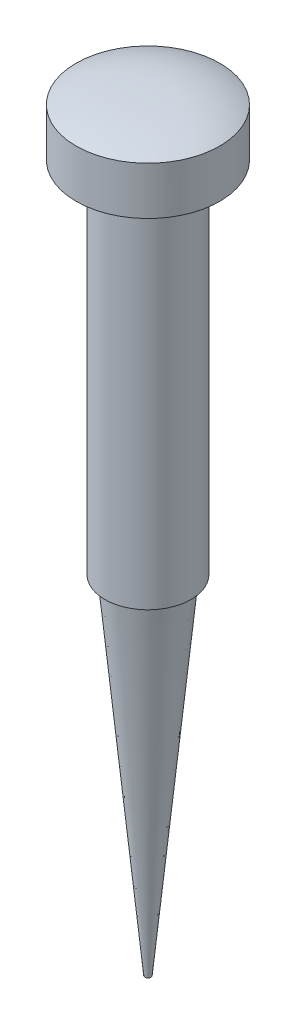
ISO-10303-21;
HEADER;
FILE_DESCRIPTION(('STEP AP214'),'2;1');
FILE_NAME('part.step','',(''),(''),'','','');
FILE_SCHEMA(('AUTOMOTIVE_DESIGN { 1 0 10303 214 1 1 1 1 }'));
ENDSEC;
DATA;
#1=APPLICATION_CONTEXT('core data for automotive mechanical design processes');
#2=APPLICATION_PROTOCOL_DEFINITION('international standard','automotive_design',2000,#1);
#3=PRODUCT_CONTEXT('',#1,'mechanical');
#4=PRODUCT('Part','Part','',(#3));
#5=PRODUCT_RELATED_PRODUCT_CATEGORY('part','',(#4));
#6=PRODUCT_DEFINITION_FORMATION('','',#4);
#7=PRODUCT_DEFINITION_CONTEXT('part definition',#1,'design');
#8=PRODUCT_DEFINITION('design','',#6,#7);
#9=PRODUCT_DEFINITION_SHAPE('','',#8);
#10=(LENGTH_UNIT() NAMED_UNIT(*) SI_UNIT(.MILLI.,.METRE.));
#11=(NAMED_UNIT(*) PLANE_ANGLE_UNIT() SI_UNIT($,.RADIAN.));
#12=(NAMED_UNIT(*) SI_UNIT($,.STERADIAN.) SOLID_ANGLE_UNIT());
#13=UNCERTAINTY_MEASURE_WITH_UNIT(LENGTH_MEASURE(1.E-05),#10,'distance_accuracy_value','');
#14=(GEOMETRIC_REPRESENTATION_CONTEXT(3) GLOBAL_UNCERTAINTY_ASSIGNED_CONTEXT((#13)) GLOBAL_UNIT_ASSIGNED_CONTEXT((#10,
#11,#12)) REPRESENTATION_CONTEXT('',''));
#15=CARTESIAN_POINT('',(0.,0.,0.));
#16=DIRECTION('',(0.,0.,1.));
#17=DIRECTION('',(1.,0.,0.));
#18=AXIS2_PLACEMENT_3D('',#15,#16,#17);
#19=CARTESIAN_POINT('',(0.,15.,0.));
#20=DIRECTION('',(0.,-1.,0.));
#21=DIRECTION('',(0.,0.,-1.));
#22=AXIS2_PLACEMENT_3D('',#19,#20,#21);
#23=CYLINDRICAL_SURFACE('',#22,1.8);
#24=CARTESIAN_POINT('',(0.,15.,0.));
#25=DIRECTION('',(0.,1.,0.));
#26=DIRECTION('',(0.,0.,1.));
#27=AXIS2_PLACEMENT_3D('',#24,#25,#26);
#28=CIRCLE('',#27,1.8);
#29=CARTESIAN_POINT('',(0.,15.,1.8));
#30=VERTEX_POINT('',#29);
#31=EDGE_CURVE('E11',#30,#30,#28,.T.);
#32=ORIENTED_EDGE('',*,*,#31,.F.);
#33=EDGE_LOOP('',(#32));
#34=FACE_BOUND('',#33,.T.);
#35=CARTESIAN_POINT('',(0.,0.,0.));
#36=DIRECTION('',(0.,1.,0.));
#37=DIRECTION('',(0.,0.,1.));
#38=AXIS2_PLACEMENT_3D('',#35,#36,#37);
#39=CIRCLE('',#38,1.8);
#40=CARTESIAN_POINT('',(0.,0.,1.8));
#41=VERTEX_POINT('',#40);
#42=EDGE_CURVE('E40',#41,#41,#39,.T.);
#43=ORIENTED_EDGE('',*,*,#42,.T.);
#44=EDGE_LOOP('',(#43));
#45=FACE_BOUND('',#44,.T.);
#46=ADVANCED_FACE('F37',(#34,#45),#23,.T.);
#47=CARTESIAN_POINT('',(0.,0.,0.));
#48=DIRECTION('',(0.,1.,0.));
#49=DIRECTION('',(0.,0.,1.));
#50=AXIS2_PLACEMENT_3D('',#47,#48,#49);
#51=PLANE('',#50);
#52=CARTESIAN_POINT('',(0.,0.,0.));
#53=DIRECTION('',(0.,1.,0.));
#54=DIRECTION('',(-1.,0.,0.));
#55=AXIS2_PLACEMENT_3D('',#52,#53,#54);
#56=CIRCLE('',#55,1.5007604023302);
#57=CARTESIAN_POINT('',(-1.5007604023302,0.,0.));
#58=VERTEX_POINT('',#57);
#59=EDGE_CURVE('E60',#58,#58,#56,.T.);
#60=ORIENTED_EDGE('',*,*,#59,.T.);
#61=EDGE_LOOP('',(#60));
#62=FACE_BOUND('',#61,.T.);
#63=ORIENTED_EDGE('',*,*,#42,.F.);
#64=EDGE_LOOP('',(#63));
#65=FACE_BOUND('',#64,.T.);
#66=ADVANCED_FACE('F79',(#62,#65),#51,.F.);
#67=CARTESIAN_POINT('',(0.,17.,0.));
#68=DIRECTION('',(0.,-1.,0.));
#69=DIRECTION('',(0.,0.,-1.));
#70=AXIS2_PLACEMENT_3D('',#67,#68,#69);
#71=CYLINDRICAL_SURFACE('',#70,3.);
#72=CARTESIAN_POINT('',(0.,17.,0.));
#73=DIRECTION('',(0.,1.,0.));
#74=DIRECTION('',(0.,0.,1.));
#75=AXIS2_PLACEMENT_3D('',#72,#73,#74);
#76=CIRCLE('',#75,3.);
#77=CARTESIAN_POINT('',(0.,17.,3.));
#78=VERTEX_POINT('',#77);
#79=EDGE_CURVE('E54',#78,#78,#76,.T.);
#80=ORIENTED_EDGE('',*,*,#79,.F.);
#81=EDGE_LOOP('',(#80));
#82=FACE_BOUND('',#81,.T.);
#83=CARTESIAN_POINT('',(0.,15.,0.));
#84=DIRECTION('',(0.,1.,0.));
#85=DIRECTION('',(0.,0.,1.));
#86=AXIS2_PLACEMENT_3D('',#83,#84,#85);
#87=CIRCLE('',#86,3.);
#88=CARTESIAN_POINT('',(0.,15.,3.));
#89=VERTEX_POINT('',#88);
#90=EDGE_CURVE('E56',#89,#89,#87,.T.);
#91=ORIENTED_EDGE('',*,*,#90,.T.);
#92=EDGE_LOOP('',(#91));
#93=FACE_BOUND('',#92,.T.);
#94=ADVANCED_FACE('F76',(#82,#93),#71,.T.);
#95=CARTESIAN_POINT('',(0.,15.,0.));
#96=DIRECTION('',(0.,1.,0.));
#97=DIRECTION('',(0.,0.,1.));
#98=AXIS2_PLACEMENT_3D('',#95,#96,#97);
#99=PLANE('',#98);
#100=ORIENTED_EDGE('',*,*,#31,.T.);
#101=EDGE_LOOP('',(#100));
#102=FACE_BOUND('',#101,.T.);
#103=ORIENTED_EDGE('',*,*,#90,.F.);
#104=EDGE_LOOP('',(#103));
#105=FACE_BOUND('',#104,.T.);
#106=ADVANCED_FACE('F50',(#102,#105),#99,.F.);
#107=CARTESIAN_POINT('',(-3.,17.,0.));
#108=CARTESIAN_POINT('',(-2.0274774752575,17.4627433731149,0.));
#109=CARTESIAN_POINT('',(-0.971060037154801,17.5,0.));
#110=CARTESIAN_POINT('',(0.,17.5,0.));
#111=B_SPLINE_CURVE_WITH_KNOTS('',3,(#107,#108,#109,#110),.UNSPECIFIED.,.F.,.F.,(4,4),(0.,1.),.UNSPECIFIED.);
#112=CARTESIAN_POINT('',(0.,17.,0.));
#113=DIRECTION('',(0.,-1.,0.));
#114=AXIS1_PLACEMENT('',#112,#113);
#115=SURFACE_OF_REVOLUTION('',#111,#114);
#116=CARTESIAN_POINT('',(0.,17.5,0.));
#117=VERTEX_POINT('',#116);
#118=VERTEX_LOOP('',#117);
#119=FACE_BOUND('',#118,.T.);
#120=ORIENTED_EDGE('',*,*,#79,.T.);
#121=EDGE_LOOP('',(#120));
#122=FACE_BOUND('',#121,.T.);
#123=ADVANCED_FACE('F46',(#119,#122),#115,.F.);
#124=CARTESIAN_POINT('',(0.,-14.5,0.));
#125=DIRECTION('',(0.,1.,0.));
#126=DIRECTION('',(-1.,0.,0.));
#127=AXIS2_PLACEMENT_3D('',#124,#125,#126);
#128=CONICAL_SURFACE('',#127,0.125,0.0945968454580859);
#129=CARTESIAN_POINT('',(0.,-14.5,0.));
#130=DIRECTION('',(0.,1.,0.));
#131=DIRECTION('',(-1.,0.,0.));
#132=AXIS2_PLACEMENT_3D('',#129,#130,#131);
#133=CIRCLE('',#132,0.125);
#134=CARTESIAN_POINT('',(-0.124999999999998,-14.5,0.));
#135=VERTEX_POINT('',#134);
#136=EDGE_CURVE('E92',#135,#135,#133,.T.);
#137=CARTESIAN_POINT('',(-1.5007604023302,0.,0.));
#138=CARTESIAN_POINT('',(-1.48642956480593,-0.151041666666668,0.));
#139=CARTESIAN_POINT('',(-1.47209872728166,-0.302083333333335,0.));
#140=CARTESIAN_POINT('',(-1.44343705223311,-0.604166666666669,0.));
#141=CARTESIAN_POINT('',(-1.42910621470884,-0.755208333333336,0.));
#142=CARTESIAN_POINT('',(-1.40044453966029,-1.05729166666667,0.));
#143=CARTESIAN_POINT('',(-1.38611370213602,-1.20833333333334,0.));
#144=CARTESIAN_POINT('',(-1.35745202708747,-1.51041666666667,0.));
#145=CARTESIAN_POINT('',(-1.3431211895632,-1.66145833333333,0.));
#146=CARTESIAN_POINT('',(-1.31445951451465,-1.96354166666667,0.));
#147=CARTESIAN_POINT('',(-1.30012867699038,-2.11458333333334,0.));
#148=CARTESIAN_POINT('',(-1.27146700194184,-2.41666666666667,0.));
#149=CARTESIAN_POINT('',(-1.25713616441756,-2.56770833333334,0.));
#150=CARTESIAN_POINT('',(-1.22847448936902,-2.86979166666667,0.));
#151=CARTESIAN_POINT('',(-1.21414365184474,-3.02083333333334,0.));
#152=CARTESIAN_POINT('',(-1.1854819767962,-3.32291666666667,0.));
#153=CARTESIAN_POINT('',(-1.17115113927192,-3.47395833333334,0.));
#154=CARTESIAN_POINT('',(-1.14248946422338,-3.77604166666667,0.));
#155=CARTESIAN_POINT('',(-1.12815862669911,-3.92708333333334,0.));
#156=CARTESIAN_POINT('',(-1.09949695165056,-4.22916666666667,0.));
#157=CARTESIAN_POINT('',(-1.08516611412629,-4.38020833333334,0.));
#158=CARTESIAN_POINT('',(-1.05650443907774,-4.68229166666667,0.));
#159=CARTESIAN_POINT('',(-1.04217360155347,-4.83333333333333,0.));
#160=CARTESIAN_POINT('',(-1.01351192650492,-5.13541666666667,0.));
#161=CARTESIAN_POINT('',(-0.999181088980649,-5.28645833333334,0.));
#162=CARTESIAN_POINT('',(-0.970519413932103,-5.58854166666667,0.));
#163=CARTESIAN_POINT('',(-0.956188576407831,-5.73958333333333,0.));
#164=CARTESIAN_POINT('',(-0.927526901359285,-6.04166666666667,0.));
#165=CARTESIAN_POINT('',(-0.913196063835012,-6.19270833333334,0.));
#166=CARTESIAN_POINT('',(-0.884534388786466,-6.49479166666667,0.));
#167=CARTESIAN_POINT('',(-0.870203551262193,-6.64583333333333,0.));
#168=CARTESIAN_POINT('',(-0.841541876213647,-6.94791666666667,0.));
#169=CARTESIAN_POINT('',(-0.827211038689374,-7.09895833333334,0.));
#170=CARTESIAN_POINT('',(-0.798549363640828,-7.40104166666667,0.));
#171=CARTESIAN_POINT('',(-0.784218526116555,-7.55208333333334,0.));
#172=CARTESIAN_POINT('',(-0.755556851068009,-7.85416666666667,0.));
#173=CARTESIAN_POINT('',(-0.741226013543736,-8.00520833333333,0.));
#174=CARTESIAN_POINT('',(-0.71256433849519,-8.30729166666667,0.));
#175=CARTESIAN_POINT('',(-0.698233500970917,-8.45833333333334,0.));
#176=CARTESIAN_POINT('',(-0.669571825922371,-8.76041666666667,0.));
#177=CARTESIAN_POINT('',(-0.655240988398098,-8.91145833333334,0.));
#178=CARTESIAN_POINT('',(-0.626579313349552,-9.21354166666667,0.));
#179=CARTESIAN_POINT('',(-0.612248475825279,-9.36458333333334,0.));
#180=CARTESIAN_POINT('',(-0.583586800776733,-9.66666666666667,0.));
#181=CARTESIAN_POINT('',(-0.56925596325246,-9.81770833333333,0.));
#182=CARTESIAN_POINT('',(-0.540594288203914,-10.1197916666667,0.));
#183=CARTESIAN_POINT('',(-0.526263450679641,-10.2708333333333,0.));
#184=CARTESIAN_POINT('',(-0.497601775631095,-10.5729166666667,0.));
#185=CARTESIAN_POINT('',(-0.483270938106822,-10.7239583333333,0.));
#186=CARTESIAN_POINT('',(-0.454609263058276,-11.0260416666667,0.));
#187=CARTESIAN_POINT('',(-0.440278425534003,-11.1770833333333,0.));
#188=CARTESIAN_POINT('',(-0.411616750485457,-11.4791666666667,0.));
#189=CARTESIAN_POINT('',(-0.397285912961184,-11.6302083333333,0.));
#190=CARTESIAN_POINT('',(-0.368624237912639,-11.9322916666667,0.));
#191=CARTESIAN_POINT('',(-0.354293400388366,-12.0833333333333,0.));
#192=CARTESIAN_POINT('',(-0.32563172533982,-12.3854166666667,0.));
#193=CARTESIAN_POINT('',(-0.311300887815547,-12.5364583333333,0.));
#194=CARTESIAN_POINT('',(-0.282639212767001,-12.8385416666667,0.));
#195=CARTESIAN_POINT('',(-0.268308375242728,-12.9895833333333,0.));
#196=CARTESIAN_POINT('',(-0.239646700194182,-13.2916666666667,0.));
#197=CARTESIAN_POINT('',(-0.225315862669909,-13.4427083333333,0.));
#198=CARTESIAN_POINT('',(-0.196654187621363,-13.7447916666667,0.));
#199=CARTESIAN_POINT('',(-0.18232335009709,-13.8958333333333,0.));
#200=CARTESIAN_POINT('',(-0.153661675048544,-14.1979166666667,0.));
#201=CARTESIAN_POINT('',(-0.139330837524271,-14.3489583333333,0.));
#202=CARTESIAN_POINT('',(-0.124999999999998,-14.5,0.));
#203=B_SPLINE_CURVE_WITH_KNOTS('',3,(#137,#138,#139,#140,#141,#142,#143,#144,#145,#146,#147,
#148,#149,#150,#151,#152,#153,#154,#155,#156,#157,#158,#159,#160,#161,#162,#163,#164,#165,#166,
#167,#168,#169,#170,#171,#172,#173,#174,#175,#176,#177,#178,#179,#180,#181,#182,#183,#184,#185,
#186,#187,#188,#189,#190,#191,#192,#193,#194,#195,#196,#197,#198,#199,#200,#201,#202),
.UNSPECIFIED.,.F.,.F.,(4,2,2,2,2,2,2,2,2,2,2,2,2,2,2,2,2,2,2,2,2,2,2,2,2,2,2,2,2,2,2,2,4),(0.,
0.455159995784256,0.910319991568513,1.36547998735277,1.82063998313702,2.27579997892128,
2.73095997470554,3.18611997048979,3.64127996627405,4.09643996205831,4.55159995784256,
5.00675995362682,5.46191994941107,5.91707994519533,6.37223994097959,6.82739993676384,
7.2825599325481,7.73771992833235,8.19287992411661,8.64803991990087,9.10319991568512,
9.55835991146938,10.0135199072536,10.4686799030379,10.9238398988222,11.3789998946064,
11.8341598903907,12.2893198861749,12.7444798819592,13.1996398777434,13.6547998735277,
14.1099598693119,14.5651198650962),.UNSPECIFIED.);
#204=EDGE_CURVE('BSEAM49',#58,#135,#203,.T.);
#205=ORIENTED_EDGE('',*,*,#59,.F.);
#206=ORIENTED_EDGE('',*,*,#136,.T.);
#207=ORIENTED_EDGE('',*,*,#204,.T.);
#208=ORIENTED_EDGE('',*,*,#204,.F.);
#209=EDGE_LOOP('',(#205,#207,#206,#208));
#210=FACE_BOUND('',#209,.T.);
#211=ADVANCED_FACE('F49',(#210),#128,.T.);
#212=CARTESIAN_POINT('',(0.125000000000002,-14.5,0.));
#213=DIRECTION('',(0.,1.,0.));
#214=DIRECTION('',(-1.,0.,0.));
#215=AXIS2_PLACEMENT_3D('',#212,#213,#214);
#216=PLANE('',#215);
#217=ORIENTED_EDGE('',*,*,#136,.F.);
#218=EDGE_LOOP('',(#217));
#219=FACE_BOUND('',#218,.T.);
#220=ADVANCED_FACE('F97',(#219),#216,.F.);
#221=CLOSED_SHELL('',(#46,#66,#94,#106,#123,#211,#220));
#222=MANIFOLD_SOLID_BREP('B2',#221);
#223=ADVANCED_BREP_SHAPE_REPRESENTATION('',(#18,#222),#14);
#224=SHAPE_DEFINITION_REPRESENTATION(#9,#223);
ENDSEC;
END-ISO-10303-21;
